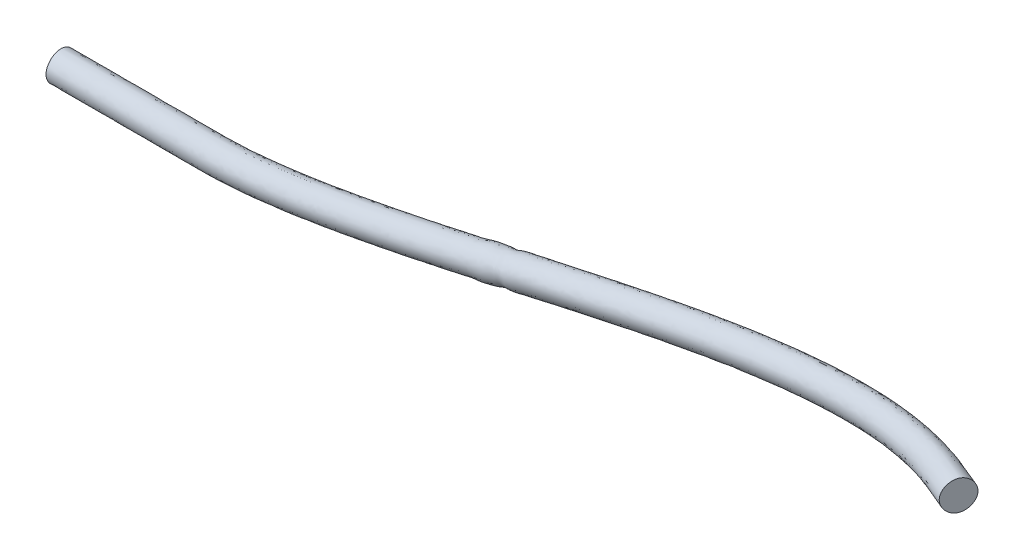
ISO-10303-21;
HEADER;
FILE_DESCRIPTION(('STEP AP214'),'2;1');
FILE_NAME('part.step','',(''),(''),'','','');
FILE_SCHEMA(('AUTOMOTIVE_DESIGN { 1 0 10303 214 1 1 1 1 }'));
ENDSEC;
DATA;
#1=APPLICATION_CONTEXT('core data for automotive mechanical design processes');
#2=APPLICATION_PROTOCOL_DEFINITION('international standard','automotive_design',2000,#1);
#3=PRODUCT_CONTEXT('',#1,'mechanical');
#4=PRODUCT('Part','Part','',(#3));
#5=PRODUCT_RELATED_PRODUCT_CATEGORY('part','',(#4));
#6=PRODUCT_DEFINITION_FORMATION('','',#4);
#7=PRODUCT_DEFINITION_CONTEXT('part definition',#1,'design');
#8=PRODUCT_DEFINITION('design','',#6,#7);
#9=PRODUCT_DEFINITION_SHAPE('','',#8);
#10=(LENGTH_UNIT() NAMED_UNIT(*) SI_UNIT(.MILLI.,.METRE.));
#11=(NAMED_UNIT(*) PLANE_ANGLE_UNIT() SI_UNIT($,.RADIAN.));
#12=(NAMED_UNIT(*) SI_UNIT($,.STERADIAN.) SOLID_ANGLE_UNIT());
#13=UNCERTAINTY_MEASURE_WITH_UNIT(LENGTH_MEASURE(1.E-05),#10,'distance_accuracy_value','');
#14=(GEOMETRIC_REPRESENTATION_CONTEXT(3) GLOBAL_UNCERTAINTY_ASSIGNED_CONTEXT((#13)) GLOBAL_UNIT_ASSIGNED_CONTEXT((#10,
#11,#12)) REPRESENTATION_CONTEXT('',''));
#15=CARTESIAN_POINT('',(0.,0.,0.));
#16=DIRECTION('',(0.,0.,1.));
#17=DIRECTION('',(1.,0.,0.));
#18=AXIS2_PLACEMENT_3D('',#15,#16,#17);
#19=CARTESIAN_POINT('',(-82.6299399470832,0.,0.));
#20=DIRECTION('',(1.,0.,0.));
#21=DIRECTION('',(0.,1.,0.));
#22=AXIS2_PLACEMENT_3D('',#19,#20,#21);
#23=PLANE('',#22);
#24=CARTESIAN_POINT('',(-82.6299399470832,1.25,0.));
#25=CARTESIAN_POINT('',(-82.6299399470832,1.24999558741716,0.0657183946874633));
#26=CARTESIAN_POINT('',(-82.6299399470832,1.24394956583357,0.131539415803641));
#27=CARTESIAN_POINT('',(-82.6299399470832,1.22055225026056,0.261231901280967));
#28=CARTESIAN_POINT('',(-82.6299399470832,1.20316765526134,0.325097041005016));
#29=CARTESIAN_POINT('',(-82.6299399470832,1.15846846051157,0.448795519901941));
#30=CARTESIAN_POINT('',(-82.6299399470832,1.13121327438215,0.50865049514221));
#31=CARTESIAN_POINT('',(-82.6299399470832,1.06805026256701,0.62353097765304));
#32=CARTESIAN_POINT('',(-82.6299399470832,1.03214578852992,0.678558344409149));
#33=CARTESIAN_POINT('',(-82.6299399470832,0.948477688214741,0.788571330541317));
#34=CARTESIAN_POINT('',(-82.6299399470832,0.899848401038124,0.842899828731647));
#35=CARTESIAN_POINT('',(-82.6299399470832,0.794666366102506,0.943256965114468));
#36=CARTESIAN_POINT('',(-82.6299399470832,0.738112208965438,0.98928412363932));
#37=CARTESIAN_POINT('',(-82.6299399470832,0.614504491258675,1.07425644878717));
#38=CARTESIAN_POINT('',(-82.6299399470832,0.547013555555073,1.11257132853079));
#39=CARTESIAN_POINT('',(-82.6299399470832,0.406201986596354,1.17622648574547));
#40=CARTESIAN_POINT('',(-82.6299399470832,0.332888359365287,1.20158209089953));
#41=CARTESIAN_POINT('',(-82.6299399470832,0.188529540403528,1.23586083062002));
#42=CARTESIAN_POINT('',(-82.6299399470832,0.117763631973834,1.24592513787598));
#43=CARTESIAN_POINT('',(-82.6299399470832,0.0112595103429495,1.2505214870948));
#44=CARTESIAN_POINT('',(-82.6299399470832,-0.0243063519106413,1.25030277681503));
#45=CARTESIAN_POINT('',(-82.6299399470832,-0.0952474056777971,1.24639614422457));
#46=CARTESIAN_POINT('',(-82.6299399470832,-0.130622594423146,1.24270817168251));
#47=CARTESIAN_POINT('',(-82.6299399470832,-0.227246756495972,1.22797453229056));
#48=CARTESIAN_POINT('',(-82.6299399470832,-0.287995596860777,1.2134846144625));
#49=CARTESIAN_POINT('',(-82.6299399470832,-0.406495104899268,1.17528654656045));
#50=CARTESIAN_POINT('',(-82.6299399470832,-0.46424378398199,1.15157236857158));
#51=CARTESIAN_POINT('',(-82.6299399470832,-0.580107274327258,1.09382084284661));
#52=CARTESIAN_POINT('',(-82.6299399470832,-0.637887907872824,1.05911394933971));
#53=CARTESIAN_POINT('',(-82.6299399470832,-0.747642939922403,0.981515022486151));
#54=CARTESIAN_POINT('',(-82.6299399470832,-0.799615816967817,0.938620852250444));
#55=CARTESIAN_POINT('',(-82.6299399470832,-0.902668214269998,0.840110874013141));
#56=CARTESIAN_POINT('',(-82.6299399470832,-0.952881261137811,0.783584207791675));
#57=CARTESIAN_POINT('',(-82.6299399470832,-1.04334075282081,0.662928840971197));
#58=CARTESIAN_POINT('',(-82.6299399470832,-1.0835761998173,0.598791865974945));
#59=CARTESIAN_POINT('',(-82.6299399470832,-1.15267816180793,0.463618043642585));
#60=CARTESIAN_POINT('',(-82.6299399470832,-1.18139857480423,0.392505954991171));
#61=CARTESIAN_POINT('',(-82.6299399470832,-1.2246054091056,0.246223827181635));
#62=CARTESIAN_POINT('',(-82.6299399470832,-1.23915008079554,0.171071745005292));
#63=CARTESIAN_POINT('',(-82.6299399470832,-1.24719849108562,0.0795158556167244));
#64=CARTESIAN_POINT('',(-82.6299399470832,-1.24824629094572,0.0636325049153092));
#65=CARTESIAN_POINT('',(-82.6299399470832,-1.24964758041922,0.0318347770840884));
#66=CARTESIAN_POINT('',(-82.6299399470832,-1.2500010689561,0.0159203999062157));
#67=CARTESIAN_POINT('',(-82.6299399470832,-1.24999558741747,-0.0657183942104355));
#68=CARTESIAN_POINT('',(-82.6299399470832,-1.2439495659219,-0.131539414849449));
#69=CARTESIAN_POINT('',(-82.6299399470832,-1.22055225068166,-0.261231899414705));
#70=CARTESIAN_POINT('',(-82.6299399470832,-1.20316765592782,-0.325097038704006));
#71=CARTESIAN_POINT('',(-82.6299399470832,-1.15846846179158,-0.44879551681357));
#72=CARTESIAN_POINT('',(-82.6299399470832,-1.1312132760286,-0.508650491700442));
#73=CARTESIAN_POINT('',(-82.6299399470832,-1.06805026504365,-0.623530973596097));
#74=CARTESIAN_POINT('',(-82.6299399470832,-1.0321457914702,-0.678558340090365));
#75=CARTESIAN_POINT('',(-82.6299399470832,-0.948477691950919,-0.788571326130636));
#76=CARTESIAN_POINT('',(-82.6299399470832,-0.899848405060002,-0.842899824461403));
#77=CARTESIAN_POINT('',(-82.6299399470832,-0.79466637067969,-0.943256961180379));
#78=CARTESIAN_POINT('',(-82.6299399470832,-0.738112213812056,-0.98928411990078));
#79=CARTESIAN_POINT('',(-82.6299399470832,-0.61450449656204,-1.07425644557359));
#80=CARTESIAN_POINT('',(-82.6299399470832,-0.547013561035106,-1.11257132563745));
#81=CARTESIAN_POINT('',(-82.6299399470832,-0.406201992375988,-1.17622648354795));
#82=CARTESIAN_POINT('',(-82.6299399470832,-0.332888365267672,-1.201582089077));
#83=CARTESIAN_POINT('',(-82.6299399470832,-0.188529546340104,-1.23586082959696));
#84=CARTESIAN_POINT('',(-82.6299399470832,-0.117763637821518,-1.24592513724948));
#85=CARTESIAN_POINT('',(-82.6299399470832,-0.0112595160019435,-1.25052148703748));
#86=CARTESIAN_POINT('',(-82.6299399470832,0.0243063463230723,-1.2503027769433));
#87=CARTESIAN_POINT('',(-82.6299399470832,0.0952474002494556,-1.24639614470381));
#88=CARTESIAN_POINT('',(-82.6299399470832,0.130622589082609,-1.24270817232717));
#89=CARTESIAN_POINT('',(-82.6299399470832,0.227246751329182,-1.22797453337436));
#90=CARTESIAN_POINT('',(-82.6299399470832,0.287995591795409,-1.21348461581263));
#91=CARTESIAN_POINT('',(-82.6299399470832,0.406495100068265,-1.17528654840141));
#92=CARTESIAN_POINT('',(-82.6299399470832,0.464243779283902,-1.15157237063686));
#93=CARTESIAN_POINT('',(-82.6299399470832,0.580107269782458,-1.09382084541018));
#94=CARTESIAN_POINT('',(-82.6299399470832,0.637887903361387,-1.05911395219674));
#95=CARTESIAN_POINT('',(-82.6299399470832,0.74764293552495,-0.981515025928271));
#96=CARTESIAN_POINT('',(-82.6299399470832,0.799615812651062,-0.938620855984285));
#97=CARTESIAN_POINT('',(-82.6299399470832,0.902668210222501,-0.840110878322247));
#98=CARTESIAN_POINT('',(-82.6299399470832,0.952881257279226,-0.783584212377064));
#99=CARTESIAN_POINT('',(-82.6299399470832,1.04334074940497,-0.662928846088754));
#100=CARTESIAN_POINT('',(-82.6299399470832,1.08357619665528,-0.598791871348302));
#101=CARTESIAN_POINT('',(-82.6299399470832,1.15267815930231,-0.463618049366363));
#102=CARTESIAN_POINT('',(-82.6299399470832,1.1813985726789,-0.392505960797177));
#103=CARTESIAN_POINT('',(-82.6299399470832,1.22460540777006,-0.246223833079711));
#104=CARTESIAN_POINT('',(-82.6299399470832,1.23915007986872,-0.171071750913289));
#105=CARTESIAN_POINT('',(-82.6299399470832,1.24719849074072,-0.0795158605174472));
#106=CARTESIAN_POINT('',(-82.6299399470832,1.24824629072969,-0.0636325088394213));
#107=CARTESIAN_POINT('',(-82.6299399470832,1.2496475803757,-0.0318347790493101));
#108=CARTESIAN_POINT('',(-82.6299399470832,1.25000106895623,-0.0159204008891577));
#109=CARTESIAN_POINT('',(-82.6299399470832,1.25,0.));
#110=B_SPLINE_CURVE_WITH_KNOTS('',3,(#24,#25,#26,#27,#28,#29,#30,#31,#32,#33,#34,#35,#36,#37,
#38,#39,#40,#41,#42,#43,#44,#45,#46,#47,#48,#49,#50,#51,#52,#53,#54,#55,#56,#57,#58,#59,#60,#61,
#62,#63,#64,#65,#66,#67,#68,#69,#70,#71,#72,#73,#74,#75,#76,#77,#78,#79,#80,#81,#82,#83,#84,#85,
#86,#87,#88,#89,#90,#91,#92,#93,#94,#95,#96,#97,#98,#99,#100,#101,#102,#103,#104,#105,#106,#107,
#108,#109),.UNSPECIFIED.,.T.,.F.,(4,2,2,2,2,2,2,2,2,2,2,2,2,2,2,2,2,2,2,2,2,2,2,2,2,2,2,2,2,2,2,
2,2,2,2,2,2,2,2,2,2,2,4),(0.,0.197089418463058,0.39476030443026,0.591260613565161,
0.787684899845368,1.00549968960701,1.22335326535688,1.45495595348212,1.68628407410146,
1.89931396401487,2.00586038276241,2.11240834421681,2.29889441608338,2.48550255907699,
2.68691000128981,2.88837008314704,3.11416855598314,3.34021482003402,3.56904468880294,
3.7969302442077,3.844675438065,3.89242070594936,4.08951012298609,4.28718100752032,
4.48368131524965,4.68010560012591,4.89792038963127,5.11577396512947,5.3473766532717,
5.57870477391749,5.79173466425892,5.8982810832163,6.0048290448797,6.19131511685245,
6.3779232599552,6.57933070180298,6.7807907832928,7.00658925588938,7.23263551970236,
7.46146538867104,7.68935094428539,7.73709614108951,7.78484141192069),.UNSPECIFIED.);
#111=CARTESIAN_POINT('',(-82.6299399470832,1.25,0.));
#112=VERTEX_POINT('',#111);
#113=EDGE_CURVE('E28',#112,#112,#110,.T.);
#114=ORIENTED_EDGE('',*,*,#113,.F.);
#115=EDGE_LOOP('',(#114));
#116=FACE_BOUND('',#115,.T.);
#117=ADVANCED_FACE('F15',(#116),#23,.F.);
#118=CARTESIAN_POINT('',(-12.0104339226486,1.5,-4.97488462074199));
#119=DIRECTION('',(0.923879532511297,0.,0.382683432365066));
#120=DIRECTION('',(0.382683432365066,0.,-0.923879532511297));
#121=AXIS2_PLACEMENT_3D('',#118,#119,#120);
#122=PLANE('',#121);
#123=CARTESIAN_POINT('',(-11.9967250392286,2.74943979905001,-5.00798079301949));
#124=CARTESIAN_POINT('',(-11.9842445963302,2.74861262568857,-5.03811124752931));
#125=CARTESIAN_POINT('',(-11.9717750245208,2.74630731564614,-5.06821545690864));
#126=CARTESIAN_POINT('',(-11.9469621900736,2.73879407879928,-5.12811893835183));
#127=CARTESIAN_POINT('',(-11.9346190109268,2.73358434536903,-5.15791800885105));
#128=CARTESIAN_POINT('',(-11.8978617157207,2.71374112653018,-5.24665796945372));
#129=CARTESIAN_POINT('',(-11.8737638039721,2.69489714351649,-5.3048354748219));
#130=CARTESIAN_POINT('',(-11.8272220044611,2.64742405601809,-5.41719731841863));
#131=CARTESIAN_POINT('',(-11.8047692094068,2.61885324765416,-5.47140316075209));
#132=CARTESIAN_POINT('',(-11.7617805996095,2.55323595221207,-5.57518684555226));
#133=CARTESIAN_POINT('',(-11.7412440432824,2.51619276325936,-5.62476647836164));
#134=CARTESIAN_POINT('',(-11.7003394438311,2.4304383596049,-5.72351891712024));
#135=CARTESIAN_POINT('',(-11.6802242861677,2.38090299389516,-5.77208120356052));
#136=CARTESIAN_POINT('',(-11.6431817222723,2.27426420842046,-5.86150986370182));
#137=CARTESIAN_POINT('',(-11.6262551273236,2.21715886886594,-5.90237427879182));
#138=CARTESIAN_POINT('',(-11.5949673442533,2.09222118050383,-5.97790966901681));
#139=CARTESIAN_POINT('',(-11.5808835445275,2.02391011620658,-6.01191096932456));
#140=CARTESIAN_POINT('',(-11.5576599553558,1.88178913370979,-6.06797767326977));
#141=CARTESIAN_POINT('',(-11.5485157751087,1.80798416564224,-6.09005367723907));
#142=CARTESIAN_POINT('',(-11.5363546921073,1.66216946127249,-6.11941312875443));
#143=CARTESIAN_POINT('',(-11.5329620534972,1.59038123184421,-6.127603682899));
#144=CARTESIAN_POINT('',(-11.531949667293,1.48254237718161,-6.13004779940355));
#145=CARTESIAN_POINT('',(-11.5322916938956,1.44656909775278,-6.12922207414093));
#146=CARTESIAN_POINT('',(-11.5343433787183,1.37489015626956,-6.12426886881624));
#147=CARTESIAN_POINT('',(-11.536052983423,1.33918448379848,-6.12014151795178));
#148=CARTESIAN_POINT('',(-11.5425355131346,1.2422217657746,-6.1044913068037));
#149=CARTESIAN_POINT('',(-11.5486378709022,1.18154606692329,-6.08975891191868));
#150=CARTESIAN_POINT('',(-11.5644150258472,1.0634762749308,-6.05166949047477));
#151=CARTESIAN_POINT('',(-11.5740924763529,1.00608465576563,-6.02830605821464));
#152=CARTESIAN_POINT('',(-11.5972763353501,0.892187627230423,-5.97233527139555));
#153=CARTESIAN_POINT('',(-11.610984957298,0.835963971249554,-5.93923973036733));
#154=CARTESIAN_POINT('',(-11.6414278971597,0.729447797079545,-5.86574397207483));
#155=CARTESIAN_POINT('',(-11.6581628041967,0.67915643687858,-5.82534233254101));
#156=CARTESIAN_POINT('',(-11.6964983293011,0.579484178919073,-5.73279218791326));
#157=CARTESIAN_POINT('',(-11.718446079847,0.53101096592204,-5.67980563088178));
#158=CARTESIAN_POINT('',(-11.7651056918794,0.444017569372248,-5.5671593626982));
#159=CARTESIAN_POINT('',(-11.7898206738327,0.405508787496141,-5.50749211807255));
#160=CARTESIAN_POINT('',(-11.8420435862227,0.339326878561037,-5.38141485471396));
#161=CARTESIAN_POINT('',(-11.8696043056333,0.311935941225539,-5.31487739212419));
#162=CARTESIAN_POINT('',(-11.926169535696,0.2713969818531,-5.17831684654804));
#163=CARTESIAN_POINT('',(-11.9551681286919,0.258194949910606,-5.10830805004775));
#164=CARTESIAN_POINT('',(-11.9926935227898,0.251360140460945,-5.01771373468307));
#165=CARTESIAN_POINT('',(-12.0010726596221,0.250485914919387,-4.99748470890163));
#166=CARTESIAN_POINT('',(-12.0178360904833,0.250049320468094,-4.9570142067646));
#167=CARTESIAN_POINT('',(-12.0262203843724,0.250486917426325,-4.93677273074666));
#168=CARTESIAN_POINT('',(-12.0597186481191,0.254921128475116,-4.85590076809326));
#169=CARTESIAN_POINT('',(-12.0847591013237,0.264284925443393,-4.79544776635889));
#170=CARTESIAN_POINT('',(-12.1338728306804,0.2942050726995,-4.67687673484721));
#171=CARTESIAN_POINT('',(-12.1579433038567,0.314791666099632,-4.61876547205214));
#172=CARTESIAN_POINT('',(-12.204353087787,0.365678070337651,-4.50672234226089));
#173=CARTESIAN_POINT('',(-12.2267016795206,0.395920509264999,-4.45276806899773));
#174=CARTESIAN_POINT('',(-12.26938754677,0.464804883148507,-4.34971526936245));
#175=CARTESIAN_POINT('',(-12.2897254669612,0.503444113077131,-4.30061518660638));
#176=CARTESIAN_POINT('',(-12.3301552997097,0.592563555367581,-4.2030089360606));
#177=CARTESIAN_POINT('',(-12.3499794007803,0.643874895059712,-4.1551493223941));
#178=CARTESIAN_POINT('',(-12.3863022913801,0.753991685810961,-4.06745810728331));
#179=CARTESIAN_POINT('',(-12.4028004895983,0.812798466453743,-4.02762793339038));
#180=CARTESIAN_POINT('',(-12.4328872128187,0.940540215308805,-3.95499215814427));
#181=CARTESIAN_POINT('',(-12.4462263974366,1.00988015392897,-3.92278851772857));
#182=CARTESIAN_POINT('',(-12.4678333120348,1.15372717559599,-3.87062481146466));
#183=CARTESIAN_POINT('',(-12.4761070184277,1.22822805357777,-3.85065031727989));
#184=CARTESIAN_POINT('',(-12.4864178436534,1.37413417727597,-3.82575778318071));
#185=CARTESIAN_POINT('',(-12.4888965191994,1.4453181326541,-3.81977373106067));
#186=CARTESIAN_POINT('',(-12.4885945721719,1.55191848355139,-3.82050269566966));
#187=CARTESIAN_POINT('',(-12.4878235200189,1.58742788688756,-3.82236418023482));
#188=CARTESIAN_POINT('',(-12.4849591879569,1.65808103720397,-3.82927928954604));
#189=CARTESIAN_POINT('',(-12.4828658889018,1.69322477888194,-3.83433296051495));
#190=CARTESIAN_POINT('',(-12.4753670967656,1.78898133281567,-3.85243664619158));
#191=CARTESIAN_POINT('',(-12.4686548953567,1.84892068451772,-3.86864133386634));
#192=CARTESIAN_POINT('',(-12.4517653066258,1.96533956548793,-3.9094164080433));
#193=CARTESIAN_POINT('',(-12.4415856462685,2.02181679649095,-3.93399228213834));
#194=CARTESIAN_POINT('',(-12.4172735917965,2.13461576174105,-3.9926867737738));
#195=CARTESIAN_POINT('',(-12.4028917339164,2.19056990463674,-4.02740765011999));
#196=CARTESIAN_POINT('',(-12.3711126098273,2.29626523629821,-4.10412924249634));
#197=CARTESIAN_POINT('',(-12.3537145886984,2.34600486424837,-4.14613178106409));
#198=CARTESIAN_POINT('',(-12.3140720162418,2.44394866191637,-4.24183741713624));
#199=CARTESIAN_POINT('',(-12.2914958940501,2.49124166166971,-4.2963409975171));
#200=CARTESIAN_POINT('',(-12.2436387689045,2.57549131384058,-4.4118783180998));
#201=CARTESIAN_POINT('',(-12.2183546980272,2.61243606743445,-4.47291946492388));
#202=CARTESIAN_POINT('',(-12.1653338050134,2.67462808812625,-4.60092322392692));
#203=CARTESIAN_POINT('',(-12.1375704875421,2.69972484058742,-4.66794980150258));
#204=CARTESIAN_POINT('',(-12.0950129637835,2.72657316084566,-4.77069275254166));
#205=CARTESIAN_POINT('',(-12.080694504132,2.73372078976,-4.8052605720246));
#206=CARTESIAN_POINT('',(-12.0518599729964,2.74424273088164,-4.87487328815686));
#207=CARTESIAN_POINT('',(-12.0373440870153,2.74762036678667,-4.90991773696234));
#208=CARTESIAN_POINT('',(-12.0141156279448,2.74987498839058,-4.96599619788332));
#209=CARTESIAN_POINT('',(-12.0054176967199,2.75001592721912,-4.98699486141105));
#210=CARTESIAN_POINT('',(-11.9967250392286,2.74943979905001,-5.00798079301949));
#211=B_SPLINE_CURVE_WITH_KNOTS('',3,(#123,#124,#125,#126,#127,#128,#129,#130,#131,#132,#133,
#134,#135,#136,#137,#138,#139,#140,#141,#142,#143,#144,#145,#146,#147,#148,#149,#150,#151,#152,
#153,#154,#155,#156,#157,#158,#159,#160,#161,#162,#163,#164,#165,#166,#167,#168,#169,#170,#171,
#172,#173,#174,#175,#176,#177,#178,#179,#180,#181,#182,#183,#184,#185,#186,#187,#188,#189,#190,
#191,#192,#193,#194,#195,#196,#197,#198,#199,#200,#201,#202,#203,#204,#205,#206,#207,#208,#209,
#210),.UNSPECIFIED.,.T.,.F.,(4,2,2,2,2,2,2,2,2,2,2,2,2,2,2,2,2,2,2,2,2,2,2,2,2,2,2,2,2,2,2,2,2,
2,2,2,2,2,2,2,2,2,2,4),(0.,0.097849702038454,0.195760337119869,0.391921649665953,
0.586927414911616,0.781857397194315,0.997633415772347,1.21346426147391,1.44504698229404,
1.67642351032116,1.89200179294837,1.99979637296135,2.10758673501494,2.29489214631089,
2.48233685034914,2.6815474315162,2.88079683459931,3.10507146790364,3.3296016010681,
3.55951962454425,3.78855933383302,3.8542710692502,3.91998109494244,4.11709433149932,
4.31474139218873,4.51123529406652,4.70766598899433,4.92548082618129,5.14333435450709,
5.37493664930412,5.60626516308547,5.81929513859146,5.92584151433556,6.03238943290664,
6.21887529849164,6.4054836478216,6.60689216788161,6.80835117173942,7.03414425475156,
7.26019590767353,7.4890467510695,7.60317168846937,7.71719593147955,7.7853484764143),.UNSPECIFIED.);
#212=CARTESIAN_POINT('',(-11.9967250392286,2.74943979905001,-5.00798079301949));
#213=VERTEX_POINT('',#212);
#214=EDGE_CURVE('E10',#213,#213,#211,.T.);
#215=ORIENTED_EDGE('',*,*,#214,.F.);
#216=EDGE_LOOP('',(#215));
#217=FACE_BOUND('',#216,.T.);
#218=ADVANCED_FACE('F36',(#217),#122,.T.);
#219=CARTESIAN_POINT('',(-82.6299399470832,1.25,0.));
#220=CARTESIAN_POINT('',(-78.4698921258124,1.25,0.));
#221=CARTESIAN_POINT('',(-74.0024289954061,1.24999647947891,-0.00310577552682439));
#222=CARTESIAN_POINT('',(-65.6959230412846,1.25000403101205,0.00355612656865198));
#223=CARTESIAN_POINT('',(-61.0036066762136,1.35450629856602,-0.822759753304109));
#224=CARTESIAN_POINT('',(-54.9581027931381,1.52715974178824,-2.03699210116269));
#225=CARTESIAN_POINT('',(-53.7412382275252,1.56509357720627,-2.29270817327218));
#226=CARTESIAN_POINT('',(-51.8952432132693,1.61373016335583,-2.63001796462737));
#227=CARTESIAN_POINT('',(-51.2773405630911,1.63112750995193,-2.73804959975035));
#228=CARTESIAN_POINT('',(-50.0150280595173,1.6279737415509,-2.85648218538661));
#229=CARTESIAN_POINT('',(-49.3749622499288,1.8111248875167,-2.85474962860542));
#230=CARTESIAN_POINT('',(-48.2716193043692,0.94669549174609,-2.4220835785944));
#231=CARTESIAN_POINT('',(-47.928336114863,0.214207079236469,-2.44766319635429));
#232=CARTESIAN_POINT('',(-47.3860595020561,-0.444846292131441,-2.98617926952797));
#233=CARTESIAN_POINT('',(-47.117826380775,-0.498709787711281,-3.2267157460852));
#234=CARTESIAN_POINT('',(-46.2637428579482,-0.631501824501533,-3.73525157154162));
#235=CARTESIAN_POINT('',(-45.6642792574632,-0.605125051762261,-3.929309550889));
#236=CARTESIAN_POINT('',(-43.8636633765222,-0.574781950830213,-4.49768926995573));
#237=CARTESIAN_POINT('',(-42.6490123658291,-0.529129809541066,-4.79731014854772));
#238=CARTESIAN_POINT('',(-36.6042219722432,-0.318693723763293,-6.24280303971155));
#239=CARTESIAN_POINT('',(-31.7332243100858,-0.131834134589419,-7.13617701255934));
#240=CARTESIAN_POINT('',(-22.4245131420553,0.149275540925335,-7.69303961614337));
#241=CARTESIAN_POINT('',(-17.9730265925843,0.251655054951798,-7.37491291474694));
#242=CARTESIAN_POINT('',(-13.3107344426132,0.251587224921971,-5.44534582754707));
#243=CARTESIAN_POINT('',(-12.6488727321879,0.251595541219544,-5.17099541065711));
#244=CARTESIAN_POINT('',(-12.0345954869132,0.251595541219544,-4.91655344460638));
#245=CARTESIAN_POINT('',(-82.6299399470832,1.25,0.654498469497874));
#246=CARTESIAN_POINT('',(-78.4418823502495,1.25,0.654498469497874));
#247=CARTESIAN_POINT('',(-74.0397230360475,1.25163744169103,0.651393242542505));
#248=CARTESIAN_POINT('',(-65.6532212015568,1.24812512209855,0.658053967949808));
#249=CARTESIAN_POINT('',(-60.8842317128858,1.35541528121948,-0.178008804829687));
#250=CARTESIAN_POINT('',(-54.8150152447263,1.48491597626373,-1.39964695446699));
#251=CARTESIAN_POINT('',(-53.5945009319116,1.51304536123909,-1.65623813014135));
#252=CARTESIAN_POINT('',(-51.7449175994143,1.51569179476949,-2.00041442715395));
#253=CARTESIAN_POINT('',(-51.1258842199174,1.51433086700996,-2.11034098510782));
#254=CARTESIAN_POINT('',(-49.8647029255812,1.41978880169844,-2.25261136807271));
#255=CARTESIAN_POINT('',(-49.2020375515155,1.52465800550621,-2.16903597140663));
#256=CARTESIAN_POINT('',(-48.1952779496905,0.306381294831285,-2.19627828615442));
#257=CARTESIAN_POINT('',(-47.9410840317901,-0.454668652760714,-2.60096094286744));
#258=CARTESIAN_POINT('',(-47.4881435742673,-0.905213367779351,-3.48487637111762));
#259=CARTESIAN_POINT('',(-47.230656539195,-0.869065574126559,-3.75776432334187));
#260=CARTESIAN_POINT('',(-46.4013292787185,-0.846051719018281,-4.34971087470951));
#261=CARTESIAN_POINT('',(-45.8016494376031,-0.792946629002481,-4.54158832190633));
#262=CARTESIAN_POINT('',(-44.0054459496837,-0.68769897931959,-5.12869951507125));
#263=CARTESIAN_POINT('',(-42.7884427710483,-0.631518347996212,-5.42864879852634));
#264=CARTESIAN_POINT('',(-36.7291670562914,-0.36386264561155,-6.8854761004746));
#265=CARTESIAN_POINT('',(-31.8280638239063,-0.182571323129305,-7.78444427911465));
#266=CARTESIAN_POINT('',(-22.4027044097874,0.110500271696067,-8.34866153627156));
#267=CARTESIAN_POINT('',(-17.7895308790861,0.217938586588129,-8.00638833128172));
#268=CARTESIAN_POINT('',(-13.0512748804475,0.218620592645976,-6.0453992441481));
#269=CARTESIAN_POINT('',(-12.4057202646919,0.218536975325358,-5.77779814358016));
#270=CARTESIAN_POINT('',(-11.7844494688333,0.218536975325358,-5.52045935402843));
#271=CARTESIAN_POINT('',(-82.6299399470832,0.654498469497872,1.25));
#272=CARTESIAN_POINT('',(-78.4132321275113,0.654498469497872,1.25));
#273=CARTESIAN_POINT('',(-74.0778698097974,0.657628947297036,1.24838844066976));
#274=CARTESIAN_POINT('',(-65.6095429786882,0.650914058719301,1.25184524248509));
#275=CARTESIAN_POINT('',(-60.7606886978599,0.760069989547044,0.406762237335769));
#276=CARTESIAN_POINT('',(-54.6757462945786,0.852435395852842,-0.861160774988579));
#277=CARTESIAN_POINT('',(-53.4534504773502,0.871694214630555,-1.12745202351262));
#278=CARTESIAN_POINT('',(-51.6098492266409,0.837855563897097,-1.51881500311126));
#279=CARTESIAN_POINT('',(-50.9936088540698,0.820874030452211,-1.64713751070249));
#280=CARTESIAN_POINT('',(-49.7531200294501,0.664520176614291,-1.89197974520541));
#281=CARTESIAN_POINT('',(-49.0836642561944,0.621011748922597,-1.80393035411579));
#282=CARTESIAN_POINT('',(-48.2535023736854,-0.492035260839571,-2.55966011489133));
#283=CARTESIAN_POINT('',(-48.0982400296156,-0.92495625799344,-3.33175209238704));
#284=CARTESIAN_POINT('',(-47.6935756598153,-0.861437253597813,-4.3426677383216));
#285=CARTESIAN_POINT('',(-47.4279718167084,-0.712512424391257,-4.56501917483615));
#286=CARTESIAN_POINT('',(-46.591063424006,-0.468741513070573,-5.09423492667635));
#287=CARTESIAN_POINT('',(-45.9855108357112,-0.393291897360175,-5.26048682348844));
#288=CARTESIAN_POINT('',(-44.1781132216047,-0.202382670772356,-5.79824978076214));
#289=CARTESIAN_POINT('',(-42.9566325474289,-0.136808896999472,-6.08929216696845));
#290=CARTESIAN_POINT('',(-36.8712757425658,0.190208551550237,-7.50656102110198));
#291=CARTESIAN_POINT('',(-31.9414795973201,0.364636515086093,-8.41734716758362));
#292=CARTESIAN_POINT('',(-22.3963436962808,0.669517529267425,-8.98137384771244));
#293=CARTESIAN_POINT('',(-17.6183664547099,0.781972473748798,-8.61240309880139));
#294=CARTESIAN_POINT('',(-12.8026722942861,0.783371239451074,-6.61863937321848));
#295=CARTESIAN_POINT('',(-12.1737654453791,0.783199743848031,-6.35801966773826));
#296=CARTESIAN_POINT('',(-11.5453411848481,0.783199743848031,-6.09771781610128));
#297=CARTESIAN_POINT('',(-82.6299399470832,-0.654498469497876,1.25));
#298=CARTESIAN_POINT('',(-78.4062744200097,-0.654498469497876,1.25));
#299=CARTESIAN_POINT('',(-74.0871337550137,-0.65136801071182,1.25167063710198));
#300=CARTESIAN_POINT('',(-65.5989357208779,-0.658082858506353,1.24808711320776));
#301=CARTESIAN_POINT('',(-60.7278735316009,-0.550401479618907,0.402670142013645));
#302=CARTESIAN_POINT('',(-54.6557884595571,-0.453359215671222,-0.952181968422178));
#303=CARTESIAN_POINT('',(-53.4368761370333,-0.433990260334908,-1.2380451475772));
#304=CARTESIAN_POINT('',(-51.6136009881708,-0.456048002766657,-1.71939814578834));
#305=CARTESIAN_POINT('',(-51.0057615001247,-0.469849297282628,-1.88436771767094));
#306=CARTESIAN_POINT('',(-49.8084952442878,-0.579297647180062,-2.30700185475971));
#307=CARTESIAN_POINT('',(-49.1693123381461,-0.79239729763748,-2.37280366828881));
#308=CARTESIAN_POINT('',(-48.5341706362052,-0.966439849940203,-3.81003556793621));
#309=CARTESIAN_POINT('',(-48.4181953987509,-0.620963741987756,-4.63153933520393));
#310=CARTESIAN_POINT('',(-47.9409764155289,0.155523013887324,-5.23082078641424));
#311=CARTESIAN_POINT('',(-47.6360385031697,0.3723252057156,-5.27738283271433));
#312=CARTESIAN_POINT('',(-46.7329531804199,0.789739695387421,-5.50188592615187));
#313=CARTESIAN_POINT('',(-46.1149239410264,0.860849117458674,-5.61617028809892));
#314=CARTESIAN_POINT('',(-44.2740952617097,1.09024555850439,-6.00799586610075));
#315=CARTESIAN_POINT('',(-43.0474767523304,1.15540981335293,-6.2788028174388));
#316=CARTESIAN_POINT('',(-36.9337606495009,1.49847357750085,-7.58644776351314));
#317=CARTESIAN_POINT('',(-32.0011045472828,1.66895143669628,-8.51202307014686));
#318=CARTESIAN_POINT('',(-22.4259794091765,1.97586739321259,-9.06092152773279));
#319=CARTESIAN_POINT('',(-17.6091141677078,2.08923200027644,-8.68155879278031));
#320=CARTESIAN_POINT('',(-12.7751276269231,2.09070663329799,-6.6785957570375));
#321=CARTESIAN_POINT('',(-12.1502007445927,2.09052583598584,-6.41982351683273));
#322=CARTESIAN_POINT('',(-11.5200392539172,2.09052583598584,-6.15880208090891));
#323=CARTESIAN_POINT('',(-82.6299399470832,-1.25,0.654498469497875));
#324=CARTESIAN_POINT('',(-78.4285941077928,-1.25,0.654498469497875));
#325=CARTESIAN_POINT('',(-74.0574158680775,-1.24836259462164,0.657661775979308));
#326=CARTESIAN_POINT('',(-65.632962831461,-1.25187483632328,0.650876469734446));
#327=CARTESIAN_POINT('',(-60.8215593618835,-1.14740086396331,-0.185824131190932));
#328=CARTESIAN_POINT('',(-54.7768985875562,-1.00896802877834,-1.573484628804));
#329=CARTESIAN_POINT('',(-53.5628462736426,-0.980628298470281,-1.86745543854227));
#330=CARTESIAN_POINT('',(-51.7520829361228,-0.955481987455661,-2.38350001105019));
#331=CARTESIAN_POINT('',(-51.1490940642167,-0.950769106266017,-2.56341730618398));
#332=CARTESIAN_POINT('',(-49.9704617955718,-0.955728257853933,-3.04524521080936));
#333=CARTESIAN_POINT('',(-49.3656133388237,-1.1747544309439,-3.2555039707332));
#334=CARTESIAN_POINT('',(-48.7313148458785,-0.599664729738836,-4.58431949502767));
#335=CARTESIAN_POINT('',(-48.5521537745974,0.125914286262591,-5.08337171881248));
#336=CARTESIAN_POINT('',(-47.960644212618,1.03703767420009,-5.18112374503062));
#337=CARTESIAN_POINT('',(-47.6280346389103,1.20282168127666,-5.11827869250549));
#338=CARTESIAN_POINT('',(-46.6723187520097,1.55747034235398,-5.12826693418489));
#339=CARTESIAN_POINT('',(-46.0488102625512,1.6022862731105,-5.22089370073107));
#340=CARTESIAN_POINT('',(-44.18875814324,1.78103908791362,-5.52928503038294));
#341=CARTESIAN_POINT('',(-42.9619424221657,1.83643759570539,-5.79058748001856));
#342=CARTESIAN_POINT('',(-36.8485044380532,2.13473950343757,-7.03804853977658));
#343=CARTESIAN_POINT('',(-31.9419390900797,2.30848668234501,-7.96526193371979));
#344=CARTESIAN_POINT('',(-22.4593044522248,2.60544473074668,-8.50058641412269));
#345=CARTESIAN_POINT('',(-17.77186031247,2.71462037319846,-8.13846597775687));
#346=CARTESIAN_POINT('',(-12.9986684408591,2.71544727516266,-6.15990750240481));
#347=CARTESIAN_POINT('',(-12.3607150013332,2.71534589288627,-5.89583480060306));
#348=CARTESIAN_POINT('',(-11.7361263403042,2.71534589288627,-5.63712170629965));
#349=CARTESIAN_POINT('',(-82.6299399470832,-1.25,-0.654498469497872));
#350=CARTESIAN_POINT('',(-78.4846136589185,-1.25,-0.654498469497872));
#351=CARTESIAN_POINT('',(-73.9828277867948,-1.25164451904588,-0.65133626015935));
#352=CARTESIAN_POINT('',(-65.7183665109167,-1.24811701849628,-0.658119213027867));
#353=CARTESIAN_POINT('',(-61.0603092885392,-1.14921882927023,-1.47532602813121));
#354=CARTESIAN_POINT('',(-55.0630736843798,-0.924480497729328,-2.84817492219755));
#355=CARTESIAN_POINT('',(-53.8563208648697,-0.876531866536479,-3.14039552480394));
#356=CARTESIAN_POINT('',(-52.0527341638328,-0.759405250282714,-3.64270708599702));
#357=CARTESIAN_POINT('',(-51.4520067505641,-0.717175820382061,-3.81883453546903));
#358=CARTESIAN_POINT('',(-50.2711120634439,-0.539358378149008,-4.25298684543716));
#359=CARTESIAN_POINT('',(-49.7114627356504,-0.601820666922913,-4.62693128513079));
#360=CARTESIAN_POINT('',(-48.8839975552359,0.680963664090774,-5.03593007990763));
#361=CARTESIAN_POINT('',(-48.5266579407431,1.46366575025702,-4.77677622578619));
#362=CARTESIAN_POINT('',(-47.7564760681956,1.95777182549584,-4.18372954185133));
#363=CARTESIAN_POINT('',(-47.4023743220705,1.94353325410728,-4.05618153799214));
#364=CARTESIAN_POINT('',(-46.3971459104692,1.98657013138734,-3.89934832784911));
#365=CARTESIAN_POINT('',(-45.7740699022713,1.97792942759094,-3.99633615869642));
#366=CARTESIAN_POINT('',(-43.9051929969169,2.00687314489237,-4.26726454015189));
#367=CARTESIAN_POINT('',(-42.6830816117274,2.04121467261595,-4.52791018005917));
#368=CARTESIAN_POINT('',(-36.5986142699567,2.225077347133,-5.75270241825911));
#369=CARTESIAN_POINT('',(-31.7522600624388,2.40996105942376,-6.66872740061527));
#370=CARTESIAN_POINT('',(-22.5029219167605,2.68299526920623,-7.1893425738602));
#371=CARTESIAN_POINT('',(-18.1388517394665,2.78205330992532,-6.87551514468731));
#372=CARTESIAN_POINT('',(-13.5175875651905,2.78138053971472,-4.95980066920275));
#373=CARTESIAN_POINT('',(-12.8470199363251,2.78146302467464,-4.68222933475696));
#374=CARTESIAN_POINT('',(-12.2364183764639,2.78146302467464,-4.42930988745555));
#375=CARTESIAN_POINT('',(-82.6299399470832,-0.654498469497876,-1.25));
#376=CARTESIAN_POINT('',(-78.5132638816567,-0.654498469497876,-1.25));
#377=CARTESIAN_POINT('',(-73.9446810130449,-0.657636024651882,-1.24833145828639));
#378=CARTESIAN_POINT('',(-65.7620447337853,-0.650905955117033,-1.25191048756339));
#379=CARTESIAN_POINT('',(-61.183852303565,-0.553873537597798,-2.06009707028809));
#380=CARTESIAN_POINT('',(-55.2023426345274,-0.291999917318436,-3.3866611016781));
#381=CARTESIAN_POINT('',(-53.9973713194312,-0.235180719928076,-3.669181631437));
#382=CARTESIAN_POINT('',(-52.1878025366062,-0.0815690194102535,-4.12430651003754));
#383=CARTESIAN_POINT('',(-51.5842821164116,-0.023718983824382,-4.28203800987218));
#384=CARTESIAN_POINT('',(-50.3826949595751,0.215910246935208,-4.61361846830664));
#385=CARTESIAN_POINT('',(-49.8298360309714,0.301825589660695,-4.99203690242162));
#386=CARTESIAN_POINT('',(-48.825773131241,1.47938021976163,-4.67254825117072));
#387=CARTESIAN_POINT('',(-48.3695019429176,1.93395335548989,-4.04598507626658));
#388=CARTESIAN_POINT('',(-47.5510439826476,1.91399571131417,-3.32593817464734));
#389=CARTESIAN_POINT('',(-47.2050590445571,1.78698010437198,-3.24892668649841));
#390=CARTESIAN_POINT('',(-46.2074117651816,1.60925992543963,-3.15482427588118));
#391=CARTESIAN_POINT('',(-45.5902085041633,1.5782746959489,-3.27743765711539));
#392=CARTESIAN_POINT('',(-43.7325257249959,1.52155683634459,-3.59771427445882));
#393=CARTESIAN_POINT('',(-42.5148918353468,1.54650522161894,-3.86726681162138));
#394=CARTESIAN_POINT('',(-36.4565055836823,1.67100614997229,-5.13161749761447));
#395=CARTESIAN_POINT('',(-31.6388442890249,1.86275322120735,-6.0358245121463));
#396=CARTESIAN_POINT('',(-22.5092826302671,2.12397801163589,-6.55663026241932));
#397=CARTESIAN_POINT('',(-18.3100161638426,2.21801942276658,-6.26950037717535));
#398=CARTESIAN_POINT('',(-13.7661901513519,2.21662989290935,-4.38656054013128));
#399=CARTESIAN_POINT('',(-13.0789747556382,2.21680025615197,-4.10200781059898));
#400=CARTESIAN_POINT('',(-12.4755266604491,2.21680025615197,-3.85205142538269));
#401=CARTESIAN_POINT('',(-82.6299399470832,0.654498469497871,-1.25));
#402=CARTESIAN_POINT('',(-78.5202215891583,0.654498469497871,-1.25));
#403=CARTESIAN_POINT('',(-73.9354170678286,0.651360933356974,-1.25161365471861));
#404=CARTESIAN_POINT('',(-65.7726519915957,0.658090962108621,-1.24815235828606));
#405=CARTESIAN_POINT('',(-61.2166674698241,0.756597931568153,-2.05600497496597));
#406=CARTESIAN_POINT('',(-55.222300469549,1.01379469420563,-3.2956399082445));
#407=CARTESIAN_POINT('',(-54.013945659748,1.07050375503779,-3.55858850737242));
#408=CARTESIAN_POINT('',(-52.1840507750764,1.2123345472533,-3.92372336736045));
#409=CARTESIAN_POINT('',(-51.5721294703567,1.26700434391039,-4.04480780290374));
#410=CARTESIAN_POINT('',(-50.3273197447373,1.45972807072963,-4.19859635875234));
#411=CARTESIAN_POINT('',(-49.7441879490198,1.71523463622077,-4.42316358824861));
#412=CARTESIAN_POINT('',(-48.5451048687212,1.95378480886226,-3.42217279812584));
#413=CARTESIAN_POINT('',(-48.0495465737823,1.629960839484,-2.7461978334497));
#414=CARTESIAN_POINT('',(-47.303643226934,0.897035443829237,-2.4377851265547));
#415=CARTESIAN_POINT('',(-46.9969923580958,0.702142474265194,-2.53656302861968));
#416=CARTESIAN_POINT('',(-46.0655220087677,0.350778716981502,-2.74717327640675));
#417=CARTESIAN_POINT('',(-45.460795398848,0.324133681130054,-2.92175419250491));
#418=CARTESIAN_POINT('',(-43.6365436848909,0.228928607067841,-3.38796818912021));
#419=CARTESIAN_POINT('',(-42.4240476304454,0.254286511266813,-3.67775616115103));
#420=CARTESIAN_POINT('',(-36.3940206767472,0.362741124020603,-5.05173075520331));
#421=CARTESIAN_POINT('',(-31.5792193390623,0.558438299598174,-5.94114860958306));
#422=CARTESIAN_POINT('',(-22.4796469173714,0.817628147689715,-6.47708258239898));
#423=CARTESIAN_POINT('',(-18.3192684508447,0.91075989623725,-6.20034468319643));
#424=CARTESIAN_POINT('',(-13.7937348187148,0.909294499062672,-4.32660415631227));
#425=CARTESIAN_POINT('',(-13.1025394564246,0.909474164014163,-4.0402039615045));
#426=CARTESIAN_POINT('',(-12.50082859138,0.909474164014163,-3.79096716057507));
#427=CARTESIAN_POINT('',(-82.6299399470832,1.25,-0.654498469497873));
#428=CARTESIAN_POINT('',(-78.4979019013752,1.25,-0.654498469497873));
#429=CARTESIAN_POINT('',(-73.9651349547648,1.24835551726679,-0.657604793596154));
#430=CARTESIAN_POINT('',(-65.7386248810125,1.25188293992555,-0.650941714812504));
#431=CARTESIAN_POINT('',(-61.1229816395414,1.35359731591256,-1.46751070177853));
#432=CARTESIAN_POINT('',(-55.1011903415498,1.56940350731274,-2.67433724785839));
#433=CARTESIAN_POINT('',(-53.8879755231387,1.61714179317344,-2.92917821640302));
#434=CARTESIAN_POINT('',(-52.0455688271243,1.71176853194217,-3.25962150210078));
#435=CARTESIAN_POINT('',(-51.4287969062647,1.74792415289391,-3.36575821439287));
#436=CARTESIAN_POINT('',(-50.1653531934534,1.83615868140336,-3.46035300270051));
#437=CARTESIAN_POINT('',(-49.5478869483421,2.0975917695272,-3.54046328580421));
#438=CARTESIAN_POINT('',(-48.3479606590479,1.5870096886609,-2.64788887103438));
#439=CARTESIAN_POINT('',(-47.9155881979358,0.883082811233652,-2.29436544984114));
#440=CARTESIAN_POINT('',(-47.2839754298449,0.0155207835164696,-2.48748216793832));
#441=CARTESIAN_POINT('',(-47.0049962223552,-0.128354001296003,-2.69566716882852));
#442=CARTESIAN_POINT('',(-46.1261564371779,-0.416951929984786,-3.12079226837373));
#443=CARTESIAN_POINT('',(-45.5269090773233,-0.41730347452204,-3.31703077987167));
#444=CARTESIAN_POINT('',(-43.7218808033606,-0.461864922340837,-3.8666790248402));
#445=CARTESIAN_POINT('',(-42.50958196061,-0.42674127108592,-4.1659714985691));
#446=CARTESIAN_POINT('',(-36.4792768881949,-0.273524801915036,-5.6001299789485));
#447=CARTESIAN_POINT('',(-31.6383847962653,-0.0810969460495331,-6.48790974600403));
#448=CARTESIAN_POINT('',(-22.4463218743232,0.188050810154603,-7.03741769601517));
#449=CARTESIAN_POINT('',(-18.1565223060825,0.285371523315466,-6.74343749821216));
#450=CARTESIAN_POINT('',(-13.5701940047789,0.284553857197966,-4.84529241094604));
#451=CARTESIAN_POINT('',(-12.8920251996839,0.28465410711373,-4.56419267773407));
#452=CARTESIAN_POINT('',(-12.284741504993,0.28465410711373,-4.31264753518433));
#453=CARTESIAN_POINT('',(-82.6299399470832,1.25,0.));
#454=CARTESIAN_POINT('',(-78.4698921258124,1.25,0.));
#455=CARTESIAN_POINT('',(-74.0024289954061,1.24999647947891,-0.00310577552682439));
#456=CARTESIAN_POINT('',(-65.6959230412846,1.25000403101205,0.00355612656865198));
#457=CARTESIAN_POINT('',(-61.0036066762136,1.35450629856602,-0.822759753304109));
#458=CARTESIAN_POINT('',(-54.9581027931381,1.52715974178824,-2.03699210116269));
#459=CARTESIAN_POINT('',(-53.7412382275252,1.56509357720627,-2.29270817327218));
#460=CARTESIAN_POINT('',(-51.8952432132693,1.61373016335583,-2.63001796462737));
#461=CARTESIAN_POINT('',(-51.2773405630911,1.63112750995193,-2.73804959975035));
#462=CARTESIAN_POINT('',(-50.0150280595173,1.6279737415509,-2.85648218538661));
#463=CARTESIAN_POINT('',(-49.3749622499288,1.8111248875167,-2.85474962860542));
#464=CARTESIAN_POINT('',(-48.2716193043692,0.94669549174609,-2.4220835785944));
#465=CARTESIAN_POINT('',(-47.928336114863,0.214207079236469,-2.44766319635429));
#466=CARTESIAN_POINT('',(-47.3860595020561,-0.444846292131441,-2.98617926952797));
#467=CARTESIAN_POINT('',(-47.117826380775,-0.498709787711281,-3.2267157460852));
#468=CARTESIAN_POINT('',(-46.2637428579482,-0.631501824501533,-3.73525157154162));
#469=CARTESIAN_POINT('',(-45.6642792574632,-0.605125051762261,-3.929309550889));
#470=CARTESIAN_POINT('',(-43.8636633765222,-0.574781950830213,-4.49768926995573));
#471=CARTESIAN_POINT('',(-42.6490123658291,-0.529129809541066,-4.79731014854772));
#472=CARTESIAN_POINT('',(-36.6042219722432,-0.318693723763293,-6.24280303971155));
#473=CARTESIAN_POINT('',(-31.7332243100858,-0.131834134589419,-7.13617701255934));
#474=CARTESIAN_POINT('',(-22.4245131420553,0.149275540925335,-7.69303961614337));
#475=CARTESIAN_POINT('',(-17.9730265925843,0.251655054951798,-7.37491291474694));
#476=CARTESIAN_POINT('',(-13.3107344426132,0.251587224921971,-5.44534582754707));
#477=CARTESIAN_POINT('',(-12.6488727321879,0.251595541219544,-5.17099541065711));
#478=CARTESIAN_POINT('',(-12.0345954869132,0.251595541219544,-4.91655344460638));
#479=B_SPLINE_SURFACE_WITH_KNOTS('',3,3,((#219,#220,#221,#222,#223,#224,#225,#226,#227,#228,
#229,#230,#231,#232,#233,#234,#235,#236,#237,#238,#239,#240,#241,#242,#243,#244),(#245,#246,
#247,#248,#249,#250,#251,#252,#253,#254,#255,#256,#257,#258,#259,#260,#261,#262,#263,#264,#265,
#266,#267,#268,#269,#270),(#271,#272,#273,#274,#275,#276,#277,#278,#279,#280,#281,#282,#283,
#284,#285,#286,#287,#288,#289,#290,#291,#292,#293,#294,#295,#296),(#297,#298,#299,#300,#301,
#302,#303,#304,#305,#306,#307,#308,#309,#310,#311,#312,#313,#314,#315,#316,#317,#318,#319,#320,
#321,#322),(#323,#324,#325,#326,#327,#328,#329,#330,#331,#332,#333,#334,#335,#336,#337,#338,
#339,#340,#341,#342,#343,#344,#345,#346,#347,#348),(#349,#350,#351,#352,#353,#354,#355,#356,
#357,#358,#359,#360,#361,#362,#363,#364,#365,#366,#367,#368,#369,#370,#371,#372,#373,#374),
(#375,#376,#377,#378,#379,#380,#381,#382,#383,#384,#385,#386,#387,#388,#389,#390,#391,#392,#393,
#394,#395,#396,#397,#398,#399,#400),(#401,#402,#403,#404,#405,#406,#407,#408,#409,#410,#411,
#412,#413,#414,#415,#416,#417,#418,#419,#420,#421,#422,#423,#424,#425,#426),(#427,#428,#429,
#430,#431,#432,#433,#434,#435,#436,#437,#438,#439,#440,#441,#442,#443,#444,#445,#446,#447,#448,
#449,#450,#451,#452),(#453,#454,#455,#456,#457,#458,#459,#460,#461,#462,#463,#464,#465,#466,
#467,#468,#469,#470,#471,#472,#473,#474,#475,#476,#477,#478)),.UNSPECIFIED.,.T.,.F.,.F.,(4,2,2,
2,4),(4,2,2,2,2,2,2,2,2,2,2,2,4),(0.,0.25,0.5,0.75,1.),(0.,0.174215496625382,0.373693002604021,
0.423562379098681,0.448497067346011,0.473431755593341,0.485899099717006,0.498366443840671,
0.523301132088001,0.57317050858266,0.7726480145613,0.972125520539939,1.),.UNSPECIFIED.);
#480=ORIENTED_EDGE('',*,*,#214,.T.);
#481=EDGE_LOOP('',(#480));
#482=FACE_BOUND('',#481,.T.);
#483=ORIENTED_EDGE('',*,*,#113,.T.);
#484=EDGE_LOOP('',(#483));
#485=FACE_BOUND('',#484,.T.);
#486=ADVANCED_FACE('F17',(#482,#485),#479,.T.);
#487=CLOSED_SHELL('',(#117,#218,#486));
#488=MANIFOLD_SOLID_BREP('B1',#487);
#489=ADVANCED_BREP_SHAPE_REPRESENTATION('',(#18,#488),#14);
#490=SHAPE_DEFINITION_REPRESENTATION(#9,#489);
ENDSEC;
END-ISO-10303-21;
